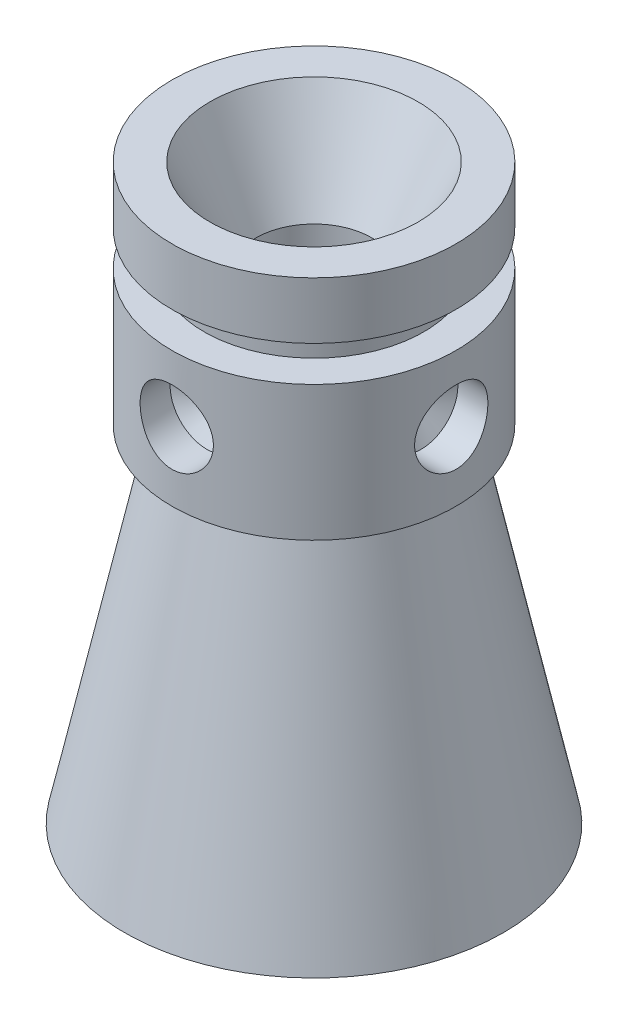
ISO-10303-21;
HEADER;
FILE_DESCRIPTION(('STEP AP214'),'2;1');
FILE_NAME('part.step','',(''),(''),'','','');
FILE_SCHEMA(('AUTOMOTIVE_DESIGN { 1 0 10303 214 1 1 1 1 }'));
ENDSEC;
DATA;
#1=APPLICATION_CONTEXT('core data for automotive mechanical design processes');
#2=APPLICATION_PROTOCOL_DEFINITION('international standard','automotive_design',2000,#1);
#3=PRODUCT_CONTEXT('',#1,'mechanical');
#4=PRODUCT('Part','Part','',(#3));
#5=PRODUCT_RELATED_PRODUCT_CATEGORY('part','',(#4));
#6=PRODUCT_DEFINITION_FORMATION('','',#4);
#7=PRODUCT_DEFINITION_CONTEXT('part definition',#1,'design');
#8=PRODUCT_DEFINITION('design','',#6,#7);
#9=PRODUCT_DEFINITION_SHAPE('','',#8);
#10=(LENGTH_UNIT() NAMED_UNIT(*) SI_UNIT(.MILLI.,.METRE.));
#11=(NAMED_UNIT(*) PLANE_ANGLE_UNIT() SI_UNIT($,.RADIAN.));
#12=(NAMED_UNIT(*) SI_UNIT($,.STERADIAN.) SOLID_ANGLE_UNIT());
#13=UNCERTAINTY_MEASURE_WITH_UNIT(LENGTH_MEASURE(1.E-05),#10,'distance_accuracy_value','');
#14=(GEOMETRIC_REPRESENTATION_CONTEXT(3) GLOBAL_UNCERTAINTY_ASSIGNED_CONTEXT((#13)) GLOBAL_UNIT_ASSIGNED_CONTEXT((#10,
#11,#12)) REPRESENTATION_CONTEXT('',''));
#15=CARTESIAN_POINT('',(0.,0.,0.));
#16=DIRECTION('',(0.,0.,1.));
#17=DIRECTION('',(1.,0.,0.));
#18=AXIS2_PLACEMENT_3D('',#15,#16,#17);
#19=CARTESIAN_POINT('',(0.,-38.4162585670867,0.));
#20=DIRECTION('',(0.,-1.,0.));
#21=DIRECTION('',(1.,0.,0.));
#22=AXIS2_PLACEMENT_3D('',#19,#20,#21);
#23=CONICAL_SURFACE('',#22,12.7,0.20943951023932);
#24=CARTESIAN_POINT('',(0.,-15.24,0.));
#25=DIRECTION('',(0.,1.,0.));
#26=DIRECTION('',(-1.,0.,0.));
#27=AXIS2_PLACEMENT_3D('',#24,#25,#26);
#28=CIRCLE('',#27,7.77373416660465);
#29=CARTESIAN_POINT('',(-7.77373416660464,-15.24,0.));
#30=VERTEX_POINT('',#29);
#31=EDGE_CURVE('E128',#30,#30,#28,.T.);
#32=ORIENTED_EDGE('',*,*,#31,.F.);
#33=EDGE_LOOP('',(#32));
#34=FACE_BOUND('',#33,.T.);
#35=CARTESIAN_POINT('',(0.,-38.4162585670867,0.));
#36=DIRECTION('',(0.,1.,0.));
#37=DIRECTION('',(-1.,0.,0.));
#38=AXIS2_PLACEMENT_3D('',#35,#36,#37);
#39=CIRCLE('',#38,12.7);
#40=CARTESIAN_POINT('',(-12.7,-38.4162585670867,0.));
#41=VERTEX_POINT('',#40);
#42=EDGE_CURVE('E95',#41,#41,#39,.T.);
#43=ORIENTED_EDGE('',*,*,#42,.T.);
#44=EDGE_LOOP('',(#43));
#45=FACE_BOUND('',#44,.T.);
#46=ADVANCED_FACE('F49',(#34,#45),#23,.T.);
#47=CARTESIAN_POINT('',(-9.525,-15.24,0.));
#48=DIRECTION('',(0.,-1.,0.));
#49=DIRECTION('',(1.,0.,0.));
#50=AXIS2_PLACEMENT_3D('',#47,#48,#49);
#51=PLANE('',#50);
#52=ORIENTED_EDGE('',*,*,#31,.T.);
#53=EDGE_LOOP('',(#52));
#54=FACE_BOUND('',#53,.T.);
#55=CARTESIAN_POINT('',(0.,-15.24,0.));
#56=DIRECTION('',(0.,1.,0.));
#57=DIRECTION('',(-1.,0.,0.));
#58=AXIS2_PLACEMENT_3D('',#55,#56,#57);
#59=CIRCLE('',#58,9.525);
#60=CARTESIAN_POINT('',(-9.525,-15.24,0.));
#61=VERTEX_POINT('',#60);
#62=EDGE_CURVE('E125',#61,#61,#59,.T.);
#63=ORIENTED_EDGE('',*,*,#62,.F.);
#64=EDGE_LOOP('',(#63));
#65=FACE_BOUND('',#64,.T.);
#66=ADVANCED_FACE('F194',(#54,#65),#51,.T.);
#67=CARTESIAN_POINT('',(0.,0.,0.));
#68=DIRECTION('',(0.,1.,0.));
#69=DIRECTION('',(-1.,0.,0.));
#70=AXIS2_PLACEMENT_3D('',#67,#68,#69);
#71=CYLINDRICAL_SURFACE('',#70,9.525);
#72=CARTESIAN_POINT('',(0.,-8.1788,-9.525));
#73=CARTESIAN_POINT('',(0.135632492235797,-8.17880353898719,-9.52499781246367));
#74=CARTESIAN_POINT('',(0.271303731287123,-8.19006653448816,-9.52207426782337));
#75=CARTESIAN_POINT('',(0.538748416943095,-8.23474767275234,-9.51069525089144));
#76=CARTESIAN_POINT('',(0.670519774125029,-8.26817747503226,-9.50223686736122));
#77=CARTESIAN_POINT('',(0.926264726293178,-8.35604098265588,-9.48072336699393));
#78=CARTESIAN_POINT('',(1.05024779121658,-8.4104485823769,-9.46767396516612));
#79=CARTESIAN_POINT('',(1.28732812222406,-8.53862906263181,-9.43836313550102));
#80=CARTESIAN_POINT('',(1.40042484949499,-8.61240290101392,-9.4221015487999));
#81=CARTESIAN_POINT('',(1.61499036171315,-8.77892201531211,-9.387730351627));
#82=CARTESIAN_POINT('',(1.71618770567399,-8.8720108766162,-9.36959076045332));
#83=CARTESIAN_POINT('',(1.90172123805714,-9.07378251088977,-9.3337039996612));
#84=CARTESIAN_POINT('',(1.9860553996045,-9.18246715570544,-9.3159568774434));
#85=CARTESIAN_POINT('',(2.13676734109603,-9.41448070107525,-9.28256012725421));
#86=CARTESIAN_POINT('',(2.20283740517176,-9.53801545031178,-9.26694845074925));
#87=CARTESIAN_POINT('',(2.31316532121822,-9.79490691829615,-9.24002913607497));
#88=CARTESIAN_POINT('',(2.35742691115491,-9.92826194934352,-9.22872076039688));
#89=CARTESIAN_POINT('',(2.42194754776775,-10.1980135114867,-9.21199722512144));
#90=CARTESIAN_POINT('',(2.44269659797878,-10.334285217627,-9.20646195669085));
#91=CARTESIAN_POINT('',(2.46113011142581,-10.6084791056988,-9.20155215677345));
#92=CARTESIAN_POINT('',(2.45881858820742,-10.746400996253,-9.20217655323605));
#93=CARTESIAN_POINT('',(2.43158660466504,-11.0161922572968,-9.20940778609847));
#94=CARTESIAN_POINT('',(2.40725427091501,-11.1481258201491,-9.21585899262482));
#95=CARTESIAN_POINT('',(2.33761134302182,-11.4059717439491,-9.23376838414501));
#96=CARTESIAN_POINT('',(2.29229916809971,-11.531883650391,-9.24522694642703));
#97=CARTESIAN_POINT('',(2.18149203307325,-11.7756682850472,-9.27199995943671));
#98=CARTESIAN_POINT('',(2.11578707031655,-11.8934410057394,-9.28735421244326));
#99=CARTESIAN_POINT('',(1.9662061746705,-12.1164981553133,-9.32016660973185));
#100=CARTESIAN_POINT('',(1.88232687313139,-12.2217802634291,-9.33762514378002));
#101=CARTESIAN_POINT('',(1.69575045115176,-12.4202332221476,-9.37333072608175));
#102=CARTESIAN_POINT('',(1.59255815895203,-12.5129377451178,-9.39158559815287));
#103=CARTESIAN_POINT('',(1.37187092289782,-12.6798176328766,-9.42634893835807));
#104=CARTESIAN_POINT('',(1.25437548459846,-12.7539923568388,-9.44285734608181));
#105=CARTESIAN_POINT('',(1.00772506118327,-12.8818943295515,-9.47235878254512));
#106=CARTESIAN_POINT('',(0.878526927485355,-12.935541754303,-9.48533803207389));
#107=CARTESIAN_POINT('',(0.612535427996886,-13.0202236733552,-9.50621885687161));
#108=CARTESIAN_POINT('',(0.475743618624078,-13.0512627832278,-9.5141214685162));
#109=CARTESIAN_POINT('',(0.20243134734827,-13.0891253632615,-9.52380364847628));
#110=CARTESIAN_POINT('',(0.0660043422474848,-13.0965833818602,-9.52574362551434));
#111=CARTESIAN_POINT('',(-0.206149628276651,-13.0888181345027,-9.52374086356539));
#112=CARTESIAN_POINT('',(-0.341876659840454,-13.0735970524096,-9.51979869099446));
#113=CARTESIAN_POINT('',(-0.606544620932313,-13.0214275538207,-9.50657776516511));
#114=CARTESIAN_POINT('',(-0.735559194986774,-12.9848289781377,-9.49738499003739));
#115=CARTESIAN_POINT('',(-0.985608289226642,-12.8913461301216,-9.47470194042491));
#116=CARTESIAN_POINT('',(-1.10664197283324,-12.8344597351562,-9.46121121627892));
#117=CARTESIAN_POINT('',(-1.33979040066358,-12.7008112945829,-9.43104841223513));
#118=CARTESIAN_POINT('',(-1.451696939741,-12.6236986602258,-9.41432173855624));
#119=CARTESIAN_POINT('',(-1.66120566581614,-12.4522312892667,-9.37962242913525));
#120=CARTESIAN_POINT('',(-1.75880520930481,-12.3578733734657,-9.36164956403528));
#121=CARTESIAN_POINT('',(-1.93957247151284,-12.1516402113158,-9.32590001087606));
#122=CARTESIAN_POINT('',(-2.02229379094201,-12.0393699533282,-9.3081408750614));
#123=CARTESIAN_POINT('',(-2.16772659095089,-11.8021709590843,-9.27535258573803));
#124=CARTESIAN_POINT('',(-2.23043894100607,-11.6772427731801,-9.26032331361727));
#125=CARTESIAN_POINT('',(-2.33360251825881,-11.4189261438211,-9.23486593745744));
#126=CARTESIAN_POINT('',(-2.37418483957775,-11.2855928598007,-9.22441081164849));
#127=CARTESIAN_POINT('',(-2.4322665612745,-11.0136821622309,-9.2092682818767));
#128=CARTESIAN_POINT('',(-2.44977140624095,-10.8751059935565,-9.2045795174938));
#129=CARTESIAN_POINT('',(-2.46090304802691,-10.6011985939546,-9.20160902688582));
#130=CARTESIAN_POINT('',(-2.45524516512481,-10.4658980648248,-9.20313535582278));
#131=CARTESIAN_POINT('',(-2.42185956117734,-10.198250475288,-9.21197663289595));
#132=CARTESIAN_POINT('',(-2.39413234085826,-10.065903347942,-9.21929144969842));
#133=CARTESIAN_POINT('',(-2.31779736783771,-9.80875503756895,-9.23877504507644));
#134=CARTESIAN_POINT('',(-2.26933201471714,-9.6839088972902,-9.25091068123445));
#135=CARTESIAN_POINT('',(-2.15300802312338,-9.44402806991174,-9.27867130546447));
#136=CARTESIAN_POINT('',(-2.08514652486313,-9.32899483288622,-9.29429680801155));
#137=CARTESIAN_POINT('',(-1.92974936749516,-9.10856839498068,-9.32781678611136));
#138=CARTESIAN_POINT('',(-1.84172122240036,-9.0035300656764,-9.34576208598717));
#139=CARTESIAN_POINT('',(-1.64943839470655,-8.80948347827698,-9.38160570875252));
#140=CARTESIAN_POINT('',(-1.54517982354077,-8.72047907272203,-9.39950401933645));
#141=CARTESIAN_POINT('',(-1.32092496361625,-8.55931601554519,-9.43365682993485));
#142=CARTESIAN_POINT('',(-1.20065985270898,-8.48752245704751,-9.44987215188289));
#143=CARTESIAN_POINT('',(-0.949356484131711,-8.36528617439028,-9.47841170674951));
#144=CARTESIAN_POINT('',(-0.81832564127577,-8.31482889983395,-9.49073858994842));
#145=CARTESIAN_POINT('',(-0.573037369789335,-8.24376034827194,-9.50839724385411));
#146=CARTESIAN_POINT('',(-0.459897445999428,-8.21945470140344,-9.51457929222433));
#147=CARTESIAN_POINT('',(-0.231180924446513,-8.18697371092571,-9.52288142833016));
#148=CARTESIAN_POINT('',(-0.115604536571404,-8.17879698359172,-9.52500186451728));
#149=CARTESIAN_POINT('',(0.,-8.1788,-9.525));
#150=B_SPLINE_CURVE_WITH_KNOTS('',3,(#72,#73,#74,#75,#76,#77,#78,#79,#80,#81,#82,#83,#84,#85,
#86,#87,#88,#89,#90,#91,#92,#93,#94,#95,#96,#97,#98,#99,#100,#101,#102,#103,#104,#105,#106,#107,
#108,#109,#110,#111,#112,#113,#114,#115,#116,#117,#118,#119,#120,#121,#122,#123,#124,#125,#126,
#127,#128,#129,#130,#131,#132,#133,#134,#135,#136,#137,#138,#139,#140,#141,#142,#143,#144,#145,
#146,#147,#148,#149),.UNSPECIFIED.,.T.,.F.,(4,2,2,2,2,2,2,2,2,2,2,2,2,2,2,2,2,2,2,2,2,2,2,2,2,2,
2,2,2,2,2,2,2,2,2,2,2,2,4),(0.,0.406473686202802,0.813161343240186,1.21934452665316,
1.62554780354791,2.03971484156758,2.45393163062685,2.87475230368938,3.2955008231013,
3.70730964680747,4.11904679906675,4.52010176214565,4.92118694863952,5.32654777081425,
5.73198379179347,6.14976363244522,6.56755791941419,6.98696074946595,7.4062779328484,
7.81421114891419,8.22210508596815,8.62350381045773,9.02494454399339,9.43386523372195,
9.84286138490288,10.2626002036206,10.6823207804033,11.0995272285728,11.5166352290525,
11.9209606517297,12.3252769010187,12.7268603507196,13.1285030408572,13.5412606648185,
13.954117331946,14.3750806952732,14.7957565155107,15.1422386395958,15.4886910371544),.UNSPECIFIED.);
#151=CARTESIAN_POINT('',(0.,-8.1788,-9.525));
#152=VERTEX_POINT('',#151);
#153=EDGE_CURVE('E11',#152,#152,#150,.T.);
#154=ORIENTED_EDGE('',*,*,#153,.F.);
#155=EDGE_LOOP('',(#154));
#156=FACE_BOUND('',#155,.T.);
#157=CARTESIAN_POINT('',(9.20253033124586,-10.63625,-2.45745));
#158=CARTESIAN_POINT('',(9.20253282061626,-10.5007022364443,-2.45744641402374));
#159=CARTESIAN_POINT('',(9.20555785819209,-10.36511563082,-2.44619700161917));
#160=CARTESIAN_POINT('',(9.21729777099537,-10.0978464867518,-2.40157469745733));
#161=CARTESIAN_POINT('',(9.22601574051651,-9.96616611218639,-2.36818977417821));
#162=CARTESIAN_POINT('',(9.24808990601585,-9.71061416460928,-2.2804574060139));
#163=CARTESIAN_POINT('',(9.26143986050791,-9.5867323472816,-2.22613815876303));
#164=CARTESIAN_POINT('',(9.2912659353246,-9.34982365577362,-2.0981661383482));
#165=CARTESIAN_POINT('',(9.30774224087956,-9.23679742536405,-2.02451221954264));
#166=CARTESIAN_POINT('',(9.34239681125506,-9.02216075325365,-1.85811777943171));
#167=CARTESIAN_POINT('',(9.36060369336536,-8.92084217082974,-1.76500666537862));
#168=CARTESIAN_POINT('',(9.39642030375577,-8.73507225176326,-1.5631385796116));
#169=CARTESIAN_POINT('',(9.41402997324792,-8.65062257167082,-1.45438007310382));
#170=CARTESIAN_POINT('',(9.44698593216792,-8.4997827341067,-1.2222934923744));
#171=CARTESIAN_POINT('',(9.4622945189036,-8.43368091994954,-1.09877219761104));
#172=CARTESIAN_POINT('',(9.48859608374544,-8.32329069084439,-0.841909481301606));
#173=CARTESIAN_POINT('',(9.49958974134042,-8.27899884111586,-0.708569609856012));
#174=CARTESIAN_POINT('',(9.51582043394744,-8.21442526884803,-0.43889923255138));
#175=CARTESIAN_POINT('',(9.5211762230654,-8.19364751574495,-0.30269477487751));
#176=CARTESIAN_POINT('',(9.52594220701936,-8.17513323273566,-0.0286351426214071));
#177=CARTESIAN_POINT('',(9.52535333573137,-8.17739308373923,0.109219769284348));
#178=CARTESIAN_POINT('',(9.51838409275901,-8.20453662219894,0.379221048130122));
#179=CARTESIAN_POINT('',(9.51214084875805,-8.22888465858391,0.511425340500211));
#180=CARTESIAN_POINT('',(9.49472503375544,-8.29865035914093,0.769804274903828));
#181=CARTESIAN_POINT('',(9.4835521911537,-8.34406918423162,0.895978584286163));
#182=CARTESIAN_POINT('',(9.45732581146241,-8.45510972844474,1.14010641246078));
#183=CARTESIAN_POINT('',(9.442236523726,-8.52091870874464,1.25797075782457));
#184=CARTESIAN_POINT('',(9.40980888795899,-8.6707286589124,1.48116848758232));
#185=CARTESIAN_POINT('',(9.39247012637968,-8.75473297576095,1.58649956098604));
#186=CARTESIAN_POINT('',(9.356839208877,-8.94140738161034,1.78483674374878));
#187=CARTESIAN_POINT('',(9.33853397595646,-9.04454515267133,1.87740081511313));
#188=CARTESIAN_POINT('',(9.30348690132806,-9.26507037571276,2.04402209218699));
#189=CARTESIAN_POINT('',(9.28674514282835,-9.38245858533815,2.11807831325937));
#190=CARTESIAN_POINT('',(9.2566710214604,-9.6290625978517,2.24588975601094));
#191=CARTESIAN_POINT('',(9.24335774264326,-9.75833939076488,2.299532104839));
#192=CARTESIAN_POINT('',(9.22188892170264,-10.0245041587722,2.38418070385714));
#193=CARTESIAN_POINT('',(9.21373219385341,-10.1613903762315,2.4151921581731));
#194=CARTESIAN_POINT('',(9.20375066213879,-10.4347724871415,2.45295177760207));
#195=CARTESIAN_POINT('',(9.20175462879208,-10.5711715811598,2.46035626898559));
#196=CARTESIAN_POINT('',(9.20385326403587,-10.8432576804668,2.45249403357838));
#197=CARTESIAN_POINT('',(9.20794733104323,-10.9789447547605,2.43722954604097));
#198=CARTESIAN_POINT('',(9.22160016046895,-11.2432749307353,2.38503963633819));
#199=CARTESIAN_POINT('',(9.23106096972559,-11.3720001795153,2.34850217892558));
#200=CARTESIAN_POINT('',(9.25428701621497,-11.6214972504174,2.25523650366697));
#201=CARTESIAN_POINT('',(9.26805278842321,-11.7422680817887,2.1985057762927));
#202=CARTESIAN_POINT('',(9.29869392912777,-11.9751924635482,2.06510977583106));
#203=CARTESIAN_POINT('',(9.31562787798557,-12.0871152958199,1.98805540295607));
#204=CARTESIAN_POINT('',(9.35055643412021,-12.2966832735275,1.81668679914962));
#205=CARTESIAN_POINT('',(9.36855122716743,-12.3943259077948,1.72236953909436));
#206=CARTESIAN_POINT('',(9.40415856412249,-12.5752514933464,1.51612913014691));
#207=CARTESIAN_POINT('',(9.42174788414069,-12.6580786739202,1.40380137345416));
#208=CARTESIAN_POINT('',(9.45406451442078,-12.8036976012778,1.16645275805285));
#209=CARTESIAN_POINT('',(9.46879197597323,-12.8664904072804,1.04143257085486));
#210=CARTESIAN_POINT('',(9.49363138455986,-12.9696968817542,0.783122577852127));
#211=CARTESIAN_POINT('',(9.50377711770396,-13.0102748527382,0.649901822349642));
#212=CARTESIAN_POINT('',(9.51845822440917,-13.0683857160971,0.378233674701578));
#213=CARTESIAN_POINT('',(9.5229947561348,-13.0859233657882,0.239787367591838));
#214=CARTESIAN_POINT('',(9.52589552971851,-13.0971736875384,-0.0341315476979129));
#215=CARTESIAN_POINT('',(9.52443352335457,-13.091557017669,-0.169575174549085));
#216=CARTESIAN_POINT('',(9.5158904015327,-13.058204219357,-0.437520234660072));
#217=CARTESIAN_POINT('',(9.50880947345723,-13.0304688285397,-0.570021765882808));
#218=CARTESIAN_POINT('',(9.48985464591976,-12.954035046978,-0.827569767066795));
#219=CARTESIAN_POINT('',(9.47801010839406,-12.9054649571832,-0.952656616475564));
#220=CARTESIAN_POINT('',(9.45077107903939,-12.7888558493343,-1.19297680205785));
#221=CARTESIAN_POINT('',(9.43537611507838,-12.7208142416878,-1.30820882495054));
#222=CARTESIAN_POINT('',(9.40220464678842,-12.5651872073271,-1.52870136989216));
#223=CARTESIAN_POINT('',(9.38437781653942,-12.4771516068796,-1.63363657228331));
#224=CARTESIAN_POINT('',(9.34856719369872,-12.2849000487682,-1.82747181300578));
#225=CARTESIAN_POINT('',(9.33058336181606,-12.1806799244735,-1.91636770931541));
#226=CARTESIAN_POINT('',(9.29607887666063,-11.9564827662692,-2.07737204980839));
#227=CARTESIAN_POINT('',(9.27959514066756,-11.8362298477767,-2.1491049008091));
#228=CARTESIAN_POINT('',(9.25046509973516,-11.5849615205986,-2.27123077041183));
#229=CARTESIAN_POINT('',(9.2378161362258,-11.4539536485464,-2.32163858286199));
#230=CARTESIAN_POINT('',(9.21966118744292,-11.2087851288843,-2.39260431180691));
#231=CARTESIAN_POINT('',(9.21328715134702,-11.0957471236009,-2.41686653736904));
#232=CARTESIAN_POINT('',(9.20472086776104,-10.8672319867811,-2.44929011944506));
#233=CARTESIAN_POINT('',(9.20252820996434,-10.75175509569,-2.45745305573858));
#234=CARTESIAN_POINT('',(9.20253033124586,-10.63625,-2.45745));
#235=B_SPLINE_CURVE_WITH_KNOTS('',3,(#157,#158,#159,#160,#161,#162,#163,#164,#165,#166,#167,
#168,#169,#170,#171,#172,#173,#174,#175,#176,#177,#178,#179,#180,#181,#182,#183,#184,#185,#186,
#187,#188,#189,#190,#191,#192,#193,#194,#195,#196,#197,#198,#199,#200,#201,#202,#203,#204,#205,
#206,#207,#208,#209,#210,#211,#212,#213,#214,#215,#216,#217,#218,#219,#220,#221,#222,#223,#224,
#225,#226,#227,#228,#229,#230,#231,#232,#233,#234),.UNSPECIFIED.,.T.,.F.,(4,2,2,2,2,2,2,2,2,2,2,
2,2,2,2,2,2,2,2,2,2,2,2,2,2,2,2,2,2,2,2,2,2,2,2,2,2,2,4),(0.,0.406218859847161,
0.812658696841881,1.21855297949672,1.62447131812657,2.03897122477347,2.45351181590962,
2.87423929037592,3.29490048462881,3.70651200656608,4.11805886742742,4.51988471490493,
4.92173270405608,5.32738646316293,5.73311490459725,6.15052199831287,6.56795129380049,
6.98765622658927,7.40726461497652,7.81510036314722,8.22289582777406,8.62347728023823,
9.02410853254487,9.43305024190081,9.84206377729024,10.2620555796765,10.6820251733846,
11.0988451699529,11.5155790888878,11.9203285117399,12.3250644373843,12.7273429768786,
13.1296750418343,13.5421678168114,13.9547669627378,14.3757049352098,14.7963504090345,
15.142537995568,15.4886916099611),.UNSPECIFIED.);
#236=CARTESIAN_POINT('',(9.20253033124586,-10.63625,-2.45745));
#237=VERTEX_POINT('',#236);
#238=EDGE_CURVE('E61',#237,#237,#235,.T.);
#239=ORIENTED_EDGE('',*,*,#238,.F.);
#240=EDGE_LOOP('',(#239));
#241=FACE_BOUND('',#240,.T.);
#242=CARTESIAN_POINT('',(0.,-13.0937,9.525));
#243=CARTESIAN_POINT('',(0.135632492235797,-13.0936964610128,9.52499781246367));
#244=CARTESIAN_POINT('',(0.271303731287124,-13.0824334655119,9.52207426782337));
#245=CARTESIAN_POINT('',(0.538748416943097,-13.0377523272477,9.51069525089144));
#246=CARTESIAN_POINT('',(0.670519774125033,-13.0043225249678,9.50223686736122));
#247=CARTESIAN_POINT('',(0.926264726293187,-12.9164590173442,9.48072336699393));
#248=CARTESIAN_POINT('',(1.05024779121659,-12.8620514176232,9.46767396516612));
#249=CARTESIAN_POINT('',(1.28732812222408,-12.7338709373683,9.43836313550102));
#250=CARTESIAN_POINT('',(1.40042484949502,-12.6600970989862,9.4221015487999));
#251=CARTESIAN_POINT('',(1.61499036171318,-12.493577984688,9.387730351627));
#252=CARTESIAN_POINT('',(1.71618770567402,-12.4004891233839,9.36959076045332));
#253=CARTESIAN_POINT('',(1.90172123805719,-12.1987174891103,9.33370399966119));
#254=CARTESIAN_POINT('',(1.98605539960455,-12.0900328442947,9.31595687744339));
#255=CARTESIAN_POINT('',(2.1367673410961,-11.8580192989249,9.28256012725419));
#256=CARTESIAN_POINT('',(2.20283740517183,-11.7344845496884,9.26694845074923));
#257=CARTESIAN_POINT('',(2.3131653212183,-11.477593081704,9.24002913607495));
#258=CARTESIAN_POINT('',(2.357426911155,-11.3442380506566,9.22872076039685));
#259=CARTESIAN_POINT('',(2.42194754776787,-11.0744864885134,9.21199722512141));
#260=CARTESIAN_POINT('',(2.4426965979789,-10.9382147823732,9.20646195669082));
#261=CARTESIAN_POINT('',(2.46113011142594,-10.6640208943013,9.20155215677341));
#262=CARTESIAN_POINT('',(2.45881858820757,-10.5260990037471,9.20217655323601));
#263=CARTESIAN_POINT('',(2.43158660466519,-10.2563077427033,9.20940778609843));
#264=CARTESIAN_POINT('',(2.40725427091517,-10.124374179851,9.21585899262478));
#265=CARTESIAN_POINT('',(2.337611343022,-9.86652825605103,9.23376838414497));
#266=CARTESIAN_POINT('',(2.2922991680999,-9.74061634960914,9.24522694642698));
#267=CARTESIAN_POINT('',(2.18149203307345,-9.4968317149529,9.27199995943667));
#268=CARTESIAN_POINT('',(2.11578707031676,-9.3790589942607,9.28735421244321));
#269=CARTESIAN_POINT('',(1.96620617467072,-9.15600184468683,9.3201666097318));
#270=CARTESIAN_POINT('',(1.88232687313162,-9.05071973657105,9.33762514377997));
#271=CARTESIAN_POINT('',(1.695750451152,-8.8522667778525,9.37333072608171));
#272=CARTESIAN_POINT('',(1.59255815895228,-8.75956225488233,9.39158559815282));
#273=CARTESIAN_POINT('',(1.37187092289807,-8.59268236712345,9.42634893835803));
#274=CARTESIAN_POINT('',(1.25437548459872,-8.51850764316128,9.44285734608178));
#275=CARTESIAN_POINT('',(1.00772506118354,-8.39060567044852,9.47235878254509));
#276=CARTESIAN_POINT('',(0.878526927485626,-8.33695824569706,9.48533803207386));
#277=CARTESIAN_POINT('',(0.612535427997161,-8.25227632664484,9.50621885687159));
#278=CARTESIAN_POINT('',(0.475743618624354,-8.22123721677224,9.51412146851619));
#279=CARTESIAN_POINT('',(0.202431347348546,-8.18337463673847,9.52380364847627));
#280=CARTESIAN_POINT('',(0.0660043422477603,-8.1759166181398,9.52574362551434));
#281=CARTESIAN_POINT('',(-0.206149628276378,-8.18368186549726,9.5237408635654));
#282=CARTESIAN_POINT('',(-0.341876659840183,-8.19890294759042,9.51979869099447));
#283=CARTESIAN_POINT('',(-0.606544620932047,-8.25107244617923,9.50657776516512));
#284=CARTESIAN_POINT('',(-0.735559194986509,-8.28767102186222,9.49738499003742));
#285=CARTESIAN_POINT('',(-0.985608289226384,-8.3811538698784,9.47470194042493));
#286=CARTESIAN_POINT('',(-1.10664197283299,-8.43804026484378,9.46121121627895));
#287=CARTESIAN_POINT('',(-1.33979040066333,-8.571688705417,9.43104841223516));
#288=CARTESIAN_POINT('',(-1.45169693974076,-8.6488013397741,9.41432173855627));
#289=CARTESIAN_POINT('',(-1.6612056658159,-8.82026871073323,9.37962242913529));
#290=CARTESIAN_POINT('',(-1.75880520930458,-8.91462662653424,9.36164956403532));
#291=CARTESIAN_POINT('',(-1.93957247151262,-9.12085978868405,9.32590001087611));
#292=CARTESIAN_POINT('',(-2.02229379094179,-9.23313004667172,9.30814087506145));
#293=CARTESIAN_POINT('',(-2.16772659095069,-9.47032904091561,9.27535258573807));
#294=CARTESIAN_POINT('',(-2.23043894100588,-9.59525722681972,9.26032331361732));
#295=CARTESIAN_POINT('',(-2.33360251825863,-9.85357385617875,9.23486593745748));
#296=CARTESIAN_POINT('',(-2.37418483957757,-9.9869071401992,9.22441081164854));
#297=CARTESIAN_POINT('',(-2.43226656127434,-10.258817837769,9.20926828187674));
#298=CARTESIAN_POINT('',(-2.4497714062408,-10.3973940064434,9.20457951749384));
#299=CARTESIAN_POINT('',(-2.46090304802678,-10.6713014060453,9.20160902688586));
#300=CARTESIAN_POINT('',(-2.45524516512468,-10.806601935175,9.20313535582281));
#301=CARTESIAN_POINT('',(-2.42185956117723,-11.0742495247118,9.21197663289598));
#302=CARTESIAN_POINT('',(-2.39413234085815,-11.2065966520579,9.21929144969845));
#303=CARTESIAN_POINT('',(-2.31779736783761,-11.4637449624309,9.23877504507646));
#304=CARTESIAN_POINT('',(-2.26933201471705,-11.5885911027097,9.25091068123447));
#305=CARTESIAN_POINT('',(-2.15300802312331,-11.8284719300881,9.27867130546448));
#306=CARTESIAN_POINT('',(-2.08514652486306,-11.9435051671137,9.29429680801156));
#307=CARTESIAN_POINT('',(-1.9297493674951,-12.1639316050192,9.32781678611137));
#308=CARTESIAN_POINT('',(-1.84172122240031,-12.2689699343235,9.34576208598718));
#309=CARTESIAN_POINT('',(-1.64943839470652,-12.4630165217229,9.38160570875253));
#310=CARTESIAN_POINT('',(-1.54517982354074,-12.5520209272779,9.39950401933645));
#311=CARTESIAN_POINT('',(-1.32092496361623,-12.7131839844547,9.43365682993485));
#312=CARTESIAN_POINT('',(-1.20065985270896,-12.7849775429524,9.44987215188289));
#313=CARTESIAN_POINT('',(-0.949356484131699,-12.9072138256097,9.47841170674951));
#314=CARTESIAN_POINT('',(-0.818325641275762,-12.957671100166,9.49073858994843));
#315=CARTESIAN_POINT('',(-0.57303736978933,-13.028739651728,9.50839724385411));
#316=CARTESIAN_POINT('',(-0.459897445999424,-13.0530452985965,9.51457929222433));
#317=CARTESIAN_POINT('',(-0.231180924446511,-13.0855262890743,9.52288142833016));
#318=CARTESIAN_POINT('',(-0.115604536571403,-13.0937030164083,9.52500186451727));
#319=CARTESIAN_POINT('',(0.,-13.0937,9.525));
#320=B_SPLINE_CURVE_WITH_KNOTS('',3,(#242,#243,#244,#245,#246,#247,#248,#249,#250,#251,#252,
#253,#254,#255,#256,#257,#258,#259,#260,#261,#262,#263,#264,#265,#266,#267,#268,#269,#270,#271,
#272,#273,#274,#275,#276,#277,#278,#279,#280,#281,#282,#283,#284,#285,#286,#287,#288,#289,#290,
#291,#292,#293,#294,#295,#296,#297,#298,#299,#300,#301,#302,#303,#304,#305,#306,#307,#308,#309,
#310,#311,#312,#313,#314,#315,#316,#317,#318,#319),.UNSPECIFIED.,.T.,.F.,(4,2,2,2,2,2,2,2,2,2,2,
2,2,2,2,2,2,2,2,2,2,2,2,2,2,2,2,2,2,2,2,2,2,2,2,2,2,2,4),(0.,0.406473686202801,
0.813161343240184,1.21934452665316,1.6255478035479,2.03971484156758,2.45393163062684,
2.87475230368937,3.2955008231013,3.70730964680747,4.11904679906675,4.52010176214565,
4.92118694863952,5.32654777081424,5.73198379179347,6.14976363244522,6.56755791941418,
6.98696074946595,7.4062779328484,7.81421114891419,8.22210508596816,8.62350381045774,
9.02494454399339,9.43386523372195,9.84286138490287,10.2626002036206,10.6823207804033,
11.0995272285728,11.5166352290525,11.9209606517297,12.3252769010187,12.7268603507196,
13.1285030408572,13.5412606648185,13.954117331946,14.3750806952732,14.7957565155107,
15.1422386395957,15.4886910371544),.UNSPECIFIED.);
#321=CARTESIAN_POINT('',(0.,-13.0937,9.525));
#322=VERTEX_POINT('',#321);
#323=EDGE_CURVE('E138',#322,#322,#320,.T.);
#324=ORIENTED_EDGE('',*,*,#323,.F.);
#325=EDGE_LOOP('',(#324));
#326=FACE_BOUND('',#325,.T.);
#327=CARTESIAN_POINT('',(-9.525,-13.0937,0.));
#328=CARTESIAN_POINT('',(-9.52499781246366,-13.0936964610128,0.135632492235796));
#329=CARTESIAN_POINT('',(-9.52207426782337,-13.0824334655118,0.271303731287122));
#330=CARTESIAN_POINT('',(-9.51069525089144,-13.0377523272477,0.538748416943095));
#331=CARTESIAN_POINT('',(-9.50223686736122,-13.0043225249678,0.670519774125031));
#332=CARTESIAN_POINT('',(-9.48072336699392,-12.9164590173442,0.926264726293184));
#333=CARTESIAN_POINT('',(-9.46767396516612,-12.8620514176231,1.05024779121659));
#334=CARTESIAN_POINT('',(-9.43836313550102,-12.7338709373682,1.28732812222408));
#335=CARTESIAN_POINT('',(-9.4221015487999,-12.6600970989861,1.40042484949501));
#336=CARTESIAN_POINT('',(-9.38773035162699,-12.493577984688,1.61499036171317));
#337=CARTESIAN_POINT('',(-9.36959076045331,-12.4004891233839,1.71618770567401));
#338=CARTESIAN_POINT('',(-9.33370399966119,-12.1987174891103,1.90172123805717));
#339=CARTESIAN_POINT('',(-9.31595687744339,-12.0900328442947,1.98605539960454));
#340=CARTESIAN_POINT('',(-9.28256012725419,-11.8580192989248,2.13676734109608));
#341=CARTESIAN_POINT('',(-9.26694845074923,-11.7344845496883,2.20283740517181));
#342=CARTESIAN_POINT('',(-9.24002913607495,-11.4775930817039,2.31316532121828));
#343=CARTESIAN_POINT('',(-9.22872076039686,-11.3442380506566,2.35742691115498));
#344=CARTESIAN_POINT('',(-9.21199722512141,-11.0744864885134,2.42194754776784));
#345=CARTESIAN_POINT('',(-9.20646195669083,-10.9382147823731,2.44269659797887));
#346=CARTESIAN_POINT('',(-9.20155215677342,-10.6640208943013,2.46113011142591));
#347=CARTESIAN_POINT('',(-9.20217655323602,-10.5260990037471,2.45881858820753));
#348=CARTESIAN_POINT('',(-9.20940778609843,-10.2563077427033,2.43158660466515));
#349=CARTESIAN_POINT('',(-9.21585899262478,-10.124374179851,2.40725427091513));
#350=CARTESIAN_POINT('',(-9.23376838414498,-9.86652825605101,2.33761134302196));
#351=CARTESIAN_POINT('',(-9.24522694642699,-9.74061634960911,2.29229916809985));
#352=CARTESIAN_POINT('',(-9.27199995943668,-9.49683171495288,2.1814920330734));
#353=CARTESIAN_POINT('',(-9.28735421244322,-9.37905899426067,2.1157870703167));
#354=CARTESIAN_POINT('',(-9.32016660973181,-9.15600184468681,1.96620617467066));
#355=CARTESIAN_POINT('',(-9.33762514377998,-9.05071973657102,1.88232687313156));
#356=CARTESIAN_POINT('',(-9.37333072608172,-8.85226677785247,1.69575045115194));
#357=CARTESIAN_POINT('',(-9.39158559815283,-8.7595622548823,1.59255815895222));
#358=CARTESIAN_POINT('',(-9.42634893835804,-8.59268236712344,1.37187092289801));
#359=CARTESIAN_POINT('',(-9.44285734608179,-8.51850764316127,1.25437548459866));
#360=CARTESIAN_POINT('',(-9.4723587825451,-8.39060567044851,1.00772506118347));
#361=CARTESIAN_POINT('',(-9.48533803207387,-8.33695824569705,0.878526927485557));
#362=CARTESIAN_POINT('',(-9.50621885687159,-8.25227632664483,0.612535427997091));
#363=CARTESIAN_POINT('',(-9.51412146851619,-8.22123721677224,0.475743618624285));
#364=CARTESIAN_POINT('',(-9.52380364847627,-8.18337463673847,0.202431347348478));
#365=CARTESIAN_POINT('',(-9.52574362551434,-8.1759166181398,0.0660043422476924));
#366=CARTESIAN_POINT('',(-9.5237408635654,-8.18368186549726,-0.206149628276445));
#367=CARTESIAN_POINT('',(-9.51979869099446,-8.19890294759043,-0.34187665984025));
#368=CARTESIAN_POINT('',(-9.50657776516512,-8.25107244617924,-0.606544620932113));
#369=CARTESIAN_POINT('',(-9.49738499003741,-8.28767102186223,-0.735559194986575));
#370=CARTESIAN_POINT('',(-9.47470194042492,-8.38115386987841,-0.985608289226447));
#371=CARTESIAN_POINT('',(-9.46121121627895,-8.4380402648438,-1.10664197283305));
#372=CARTESIAN_POINT('',(-9.43104841223515,-8.57168870541702,-1.33979040066339));
#373=CARTESIAN_POINT('',(-9.41432173855626,-8.64880133977412,-1.45169693974082));
#374=CARTESIAN_POINT('',(-9.37962242913528,-8.82026871073325,-1.66120566581596));
#375=CARTESIAN_POINT('',(-9.36164956403531,-8.91462662653427,-1.75880520930464));
#376=CARTESIAN_POINT('',(-9.32590001087609,-9.12085978868408,-1.93957247151267));
#377=CARTESIAN_POINT('',(-9.30814087506143,-9.23313004667175,-2.02229379094184));
#378=CARTESIAN_POINT('',(-9.27535258573806,-9.47032904091564,-2.16772659095074));
#379=CARTESIAN_POINT('',(-9.2603233136173,-9.59525722681975,-2.23043894100593));
#380=CARTESIAN_POINT('',(-9.23486593745747,-9.85357385617879,-2.33360251825868));
#381=CARTESIAN_POINT('',(-9.22441081164853,-9.98690714019924,-2.37418483957762));
#382=CARTESIAN_POINT('',(-9.20926828187673,-10.258817837769,-2.43226656127438));
#383=CARTESIAN_POINT('',(-9.20457951749383,-10.3973940064434,-2.44977140624084));
#384=CARTESIAN_POINT('',(-9.20160902688585,-10.6713014060453,-2.46090304802681));
#385=CARTESIAN_POINT('',(-9.20313535582281,-10.8066019351751,-2.45524516512471));
#386=CARTESIAN_POINT('',(-9.21197663289597,-11.0742495247119,-2.42185956117725));
#387=CARTESIAN_POINT('',(-9.21929144969844,-11.2065966520579,-2.39413234085818));
#388=CARTESIAN_POINT('',(-9.23877504507645,-11.463744962431,-2.31779736783764));
#389=CARTESIAN_POINT('',(-9.25091068123447,-11.5885911027097,-2.26933201471708));
#390=CARTESIAN_POINT('',(-9.27867130546448,-11.8284719300882,-2.15300802312333));
#391=CARTESIAN_POINT('',(-9.29429680801156,-11.9435051671137,-2.08514652486308));
#392=CARTESIAN_POINT('',(-9.32781678611136,-12.1639316050192,-1.92974936749512));
#393=CARTESIAN_POINT('',(-9.34576208598717,-12.2689699343235,-1.84172122240032));
#394=CARTESIAN_POINT('',(-9.38160570875252,-12.463016521723,-1.64943839470653));
#395=CARTESIAN_POINT('',(-9.39950401933645,-12.5520209272779,-1.54517982354075));
#396=CARTESIAN_POINT('',(-9.43365682993485,-12.7131839844548,-1.32092496361624));
#397=CARTESIAN_POINT('',(-9.44987215188289,-12.7849775429524,-1.20065985270897));
#398=CARTESIAN_POINT('',(-9.4784117067495,-12.9072138256097,-0.949356484131705));
#399=CARTESIAN_POINT('',(-9.49073858994842,-12.957671100166,-0.818325641275767));
#400=CARTESIAN_POINT('',(-9.50839724385411,-13.028739651728,-0.573037369789336));
#401=CARTESIAN_POINT('',(-9.51457929222433,-13.0530452985965,-0.459897445999428));
#402=CARTESIAN_POINT('',(-9.52288142833016,-13.0855262890743,-0.231180924446514));
#403=CARTESIAN_POINT('',(-9.52500186451727,-13.0937030164083,-0.115604536571405));
#404=CARTESIAN_POINT('',(-9.525,-13.0937,0.));
#405=B_SPLINE_CURVE_WITH_KNOTS('',3,(#327,#328,#329,#330,#331,#332,#333,#334,#335,#336,#337,
#338,#339,#340,#341,#342,#343,#344,#345,#346,#347,#348,#349,#350,#351,#352,#353,#354,#355,#356,
#357,#358,#359,#360,#361,#362,#363,#364,#365,#366,#367,#368,#369,#370,#371,#372,#373,#374,#375,
#376,#377,#378,#379,#380,#381,#382,#383,#384,#385,#386,#387,#388,#389,#390,#391,#392,#393,#394,
#395,#396,#397,#398,#399,#400,#401,#402,#403,#404),.UNSPECIFIED.,.T.,.F.,(4,2,2,2,2,2,2,2,2,2,2,
2,2,2,2,2,2,2,2,2,2,2,2,2,2,2,2,2,2,2,2,2,2,2,2,2,2,2,4),(0.,0.406473686202802,
0.813161343240184,1.21934452665316,1.6255478035479,2.03971484156758,2.45393163062684,
2.87475230368937,3.2955008231013,3.70730964680747,4.11904679906675,4.52010176214565,
4.92118694863952,5.32654777081424,5.73198379179347,6.14976363244522,6.56755791941419,
6.98696074946595,7.4062779328484,7.81421114891419,8.22210508596815,8.62350381045773,
9.02494454399338,9.43386523372194,9.84286138490287,10.2626002036206,10.6823207804033,
11.0995272285728,11.5166352290525,11.9209606517297,12.3252769010187,12.7268603507196,
13.1285030408572,13.5412606648185,13.954117331946,14.3750806952732,14.7957565155107,
15.1422386395957,15.4886910371544),.UNSPECIFIED.);
#406=CARTESIAN_POINT('',(-9.525,-13.0937,0.));
#407=VERTEX_POINT('',#406);
#408=EDGE_CURVE('E131',#407,#407,#405,.T.);
#409=ORIENTED_EDGE('',*,*,#408,.F.);
#410=EDGE_LOOP('',(#409));
#411=FACE_BOUND('',#410,.T.);
#412=ORIENTED_EDGE('',*,*,#62,.T.);
#413=EDGE_LOOP('',(#412));
#414=FACE_BOUND('',#413,.T.);
#415=CARTESIAN_POINT('',(0.,-6.19125,0.));
#416=DIRECTION('',(0.,1.,0.));
#417=DIRECTION('',(-1.,0.,0.));
#418=AXIS2_PLACEMENT_3D('',#415,#416,#417);
#419=CIRCLE('',#418,9.525);
#420=CARTESIAN_POINT('',(-9.525,-6.19125,0.));
#421=VERTEX_POINT('',#420);
#422=EDGE_CURVE('E122',#421,#421,#419,.T.);
#423=ORIENTED_EDGE('',*,*,#422,.F.);
#424=EDGE_LOOP('',(#423));
#425=FACE_BOUND('',#424,.T.);
#426=ADVANCED_FACE('F143',(#156,#241,#326,#411,#414,#425),#71,.T.);
#427=CARTESIAN_POINT('',(-7.366,-6.19125,0.));
#428=DIRECTION('',(0.,1.,0.));
#429=DIRECTION('',(-1.,0.,0.));
#430=AXIS2_PLACEMENT_3D('',#427,#428,#429);
#431=PLANE('',#430);
#432=ORIENTED_EDGE('',*,*,#422,.T.);
#433=EDGE_LOOP('',(#432));
#434=FACE_BOUND('',#433,.T.);
#435=CARTESIAN_POINT('',(0.,-6.19125,0.));
#436=DIRECTION('',(0.,1.,0.));
#437=DIRECTION('',(-1.,0.,0.));
#438=AXIS2_PLACEMENT_3D('',#435,#436,#437);
#439=CIRCLE('',#438,7.366);
#440=CARTESIAN_POINT('',(-7.366,-6.19125,0.));
#441=VERTEX_POINT('',#440);
#442=EDGE_CURVE('E119',#441,#441,#439,.T.);
#443=ORIENTED_EDGE('',*,*,#442,.F.);
#444=EDGE_LOOP('',(#443));
#445=FACE_BOUND('',#444,.T.);
#446=ADVANCED_FACE('F186',(#434,#445),#431,.T.);
#447=CARTESIAN_POINT('',(0.,0.,0.));
#448=DIRECTION('',(0.,1.,0.));
#449=DIRECTION('',(-1.,0.,0.));
#450=AXIS2_PLACEMENT_3D('',#447,#448,#449);
#451=CYLINDRICAL_SURFACE('',#450,7.366);
#452=ORIENTED_EDGE('',*,*,#442,.T.);
#453=EDGE_LOOP('',(#452));
#454=FACE_BOUND('',#453,.T.);
#455=CARTESIAN_POINT('',(0.,-3.81,0.));
#456=DIRECTION('',(0.,1.,0.));
#457=DIRECTION('',(-1.,0.,0.));
#458=AXIS2_PLACEMENT_3D('',#455,#456,#457);
#459=CIRCLE('',#458,7.366);
#460=CARTESIAN_POINT('',(-7.366,-3.81,0.));
#461=VERTEX_POINT('',#460);
#462=EDGE_CURVE('E116',#461,#461,#459,.T.);
#463=ORIENTED_EDGE('',*,*,#462,.F.);
#464=EDGE_LOOP('',(#463));
#465=FACE_BOUND('',#464,.T.);
#466=ADVANCED_FACE('F183',(#454,#465),#451,.T.);
#467=CARTESIAN_POINT('',(-9.525,-3.81,0.));
#468=DIRECTION('',(0.,-1.,0.));
#469=DIRECTION('',(1.,0.,0.));
#470=AXIS2_PLACEMENT_3D('',#467,#468,#469);
#471=PLANE('',#470);
#472=ORIENTED_EDGE('',*,*,#462,.T.);
#473=EDGE_LOOP('',(#472));
#474=FACE_BOUND('',#473,.T.);
#475=CARTESIAN_POINT('',(0.,-3.81,0.));
#476=DIRECTION('',(0.,1.,0.));
#477=DIRECTION('',(-1.,0.,0.));
#478=AXIS2_PLACEMENT_3D('',#475,#476,#477);
#479=CIRCLE('',#478,9.525);
#480=CARTESIAN_POINT('',(-9.525,-3.81,0.));
#481=VERTEX_POINT('',#480);
#482=EDGE_CURVE('E113',#481,#481,#479,.T.);
#483=ORIENTED_EDGE('',*,*,#482,.F.);
#484=EDGE_LOOP('',(#483));
#485=FACE_BOUND('',#484,.T.);
#486=ADVANCED_FACE('F179',(#474,#485),#471,.T.);
#487=CARTESIAN_POINT('',(0.,0.,0.));
#488=DIRECTION('',(0.,1.,0.));
#489=DIRECTION('',(-1.,0.,0.));
#490=AXIS2_PLACEMENT_3D('',#487,#488,#489);
#491=CYLINDRICAL_SURFACE('',#490,9.525);
#492=ORIENTED_EDGE('',*,*,#482,.T.);
#493=EDGE_LOOP('',(#492));
#494=FACE_BOUND('',#493,.T.);
#495=CARTESIAN_POINT('',(0.,0.,0.));
#496=DIRECTION('',(0.,1.,0.));
#497=DIRECTION('',(-1.,0.,0.));
#498=AXIS2_PLACEMENT_3D('',#495,#496,#497);
#499=CIRCLE('',#498,9.525);
#500=CARTESIAN_POINT('',(-9.525,0.,0.));
#501=VERTEX_POINT('',#500);
#502=EDGE_CURVE('E110',#501,#501,#499,.T.);
#503=ORIENTED_EDGE('',*,*,#502,.F.);
#504=EDGE_LOOP('',(#503));
#505=FACE_BOUND('',#504,.T.);
#506=ADVANCED_FACE('F175',(#494,#505),#491,.T.);
#507=CARTESIAN_POINT('',(-6.985,0.,0.));
#508=DIRECTION('',(0.,1.,0.));
#509=DIRECTION('',(-1.,0.,0.));
#510=AXIS2_PLACEMENT_3D('',#507,#508,#509);
#511=PLANE('',#510);
#512=ORIENTED_EDGE('',*,*,#502,.T.);
#513=EDGE_LOOP('',(#512));
#514=FACE_BOUND('',#513,.T.);
#515=CARTESIAN_POINT('',(0.,0.,0.));
#516=DIRECTION('',(0.,1.,0.));
#517=DIRECTION('',(-1.,0.,0.));
#518=AXIS2_PLACEMENT_3D('',#515,#516,#517);
#519=CIRCLE('',#518,6.985);
#520=CARTESIAN_POINT('',(-6.985,0.,0.));
#521=VERTEX_POINT('',#520);
#522=EDGE_CURVE('E107',#521,#521,#519,.T.);
#523=ORIENTED_EDGE('',*,*,#522,.F.);
#524=EDGE_LOOP('',(#523));
#525=FACE_BOUND('',#524,.T.);
#526=ADVANCED_FACE('F171',(#514,#525),#511,.T.);
#527=CARTESIAN_POINT('',(0.,0.,0.));
#528=DIRECTION('',(0.,1.,0.));
#529=DIRECTION('',(-1.,0.,0.));
#530=AXIS2_PLACEMENT_3D('',#527,#528,#529);
#531=CONICAL_SURFACE('',#530,6.985,0.454281387106424);
#532=CARTESIAN_POINT('',(0.,-6.35,0.));
#533=DIRECTION('',(0.,1.,0.));
#534=DIRECTION('',(-1.,0.,0.));
#535=AXIS2_PLACEMENT_3D('',#532,#533,#534);
#536=CIRCLE('',#535,3.884);
#537=CARTESIAN_POINT('',(-3.884,-6.35,0.));
#538=VERTEX_POINT('',#537);
#539=EDGE_CURVE('E104',#538,#538,#536,.T.);
#540=ORIENTED_EDGE('',*,*,#539,.F.);
#541=EDGE_LOOP('',(#540));
#542=FACE_BOUND('',#541,.T.);
#543=ORIENTED_EDGE('',*,*,#522,.T.);
#544=EDGE_LOOP('',(#543));
#545=FACE_BOUND('',#544,.T.);
#546=ADVANCED_FACE('F167',(#542,#545),#531,.F.);
#547=CARTESIAN_POINT('',(0.,0.,0.));
#548=DIRECTION('',(0.,1.,0.));
#549=DIRECTION('',(-1.,0.,0.));
#550=AXIS2_PLACEMENT_3D('',#547,#548,#549);
#551=CYLINDRICAL_SURFACE('',#550,3.884);
#552=ORIENTED_EDGE('',*,*,#539,.T.);
#553=EDGE_LOOP('',(#552));
#554=FACE_BOUND('',#553,.T.);
#555=CARTESIAN_POINT('',(0.,-8.89,0.));
#556=DIRECTION('',(0.,1.,0.));
#557=DIRECTION('',(-1.,0.,0.));
#558=AXIS2_PLACEMENT_3D('',#555,#556,#557);
#559=CIRCLE('',#558,3.884);
#560=CARTESIAN_POINT('',(-3.884,-8.89,0.));
#561=VERTEX_POINT('',#560);
#562=EDGE_CURVE('E101',#561,#561,#559,.T.);
#563=ORIENTED_EDGE('',*,*,#562,.F.);
#564=EDGE_LOOP('',(#563));
#565=FACE_BOUND('',#564,.T.);
#566=ADVANCED_FACE('F163',(#554,#565),#551,.F.);
#567=CARTESIAN_POINT('',(0.,-38.4162585670867,0.));
#568=DIRECTION('',(0.,-1.,0.));
#569=DIRECTION('',(1.,0.,0.));
#570=AXIS2_PLACEMENT_3D('',#567,#568,#569);
#571=CONICAL_SURFACE('',#570,10.16,0.20943951023932);
#572=ORIENTED_EDGE('',*,*,#562,.T.);
#573=EDGE_LOOP('',(#572));
#574=FACE_BOUND('',#573,.T.);
#575=CARTESIAN_POINT('',(0.,-38.4162585670867,0.));
#576=DIRECTION('',(0.,1.,0.));
#577=DIRECTION('',(-1.,0.,0.));
#578=AXIS2_PLACEMENT_3D('',#575,#576,#577);
#579=CIRCLE('',#578,10.16);
#580=CARTESIAN_POINT('',(-10.16,-38.4162585670867,0.));
#581=VERTEX_POINT('',#580);
#582=EDGE_CURVE('E98',#581,#581,#579,.T.);
#583=ORIENTED_EDGE('',*,*,#582,.F.);
#584=EDGE_LOOP('',(#583));
#585=FACE_BOUND('',#584,.T.);
#586=ADVANCED_FACE('F159',(#574,#585),#571,.F.);
#587=CARTESIAN_POINT('',(-12.7,-38.4162585670867,0.));
#588=DIRECTION('',(0.,-1.,0.));
#589=DIRECTION('',(1.,0.,0.));
#590=AXIS2_PLACEMENT_3D('',#587,#588,#589);
#591=PLANE('',#590);
#592=ORIENTED_EDGE('',*,*,#582,.T.);
#593=EDGE_LOOP('',(#592));
#594=FACE_BOUND('',#593,.T.);
#595=ORIENTED_EDGE('',*,*,#42,.F.);
#596=EDGE_LOOP('',(#595));
#597=FACE_BOUND('',#596,.T.);
#598=ADVANCED_FACE('F156',(#594,#597),#591,.T.);
#599=CARTESIAN_POINT('',(-7.19158492822928,-10.63625,0.));
#600=DIRECTION('',(-1.,0.,0.));
#601=DIRECTION('',(0.,0.,1.));
#602=AXIS2_PLACEMENT_3D('',#599,#600,#601);
#603=CONICAL_SURFACE('',#602,2.45745,1.02974425867665);
#604=CARTESIAN_POINT('',(-5.715,-10.63625,0.));
#605=VERTEX_POINT('',#604);
#606=VERTEX_LOOP('',#605);
#607=FACE_BOUND('',#606,.T.);
#608=CARTESIAN_POINT('',(-7.19158492822928,-10.63625,0.));
#609=DIRECTION('',(-1.,0.,0.));
#610=DIRECTION('',(0.,0.,1.));
#611=AXIS2_PLACEMENT_3D('',#608,#609,#610);
#612=CIRCLE('',#611,2.45745);
#613=CARTESIAN_POINT('',(-7.19158492822928,-10.63625,2.45745));
#614=VERTEX_POINT('',#613);
#615=EDGE_CURVE('E92',#614,#614,#612,.T.);
#616=ORIENTED_EDGE('',*,*,#615,.T.);
#617=EDGE_LOOP('',(#616));
#618=FACE_BOUND('',#617,.T.);
#619=ADVANCED_FACE('F152',(#607,#618),#603,.F.);
#620=CARTESIAN_POINT('',(-9.525,-10.63625,0.));
#621=DIRECTION('',(-1.,0.,0.));
#622=DIRECTION('',(0.,0.,1.));
#623=AXIS2_PLACEMENT_3D('',#620,#621,#622);
#624=CYLINDRICAL_SURFACE('',#623,2.45744999999999);
#625=ORIENTED_EDGE('',*,*,#408,.T.);
#626=EDGE_LOOP('',(#625));
#627=FACE_BOUND('',#626,.T.);
#628=ORIENTED_EDGE('',*,*,#615,.F.);
#629=EDGE_LOOP('',(#628));
#630=FACE_BOUND('',#629,.T.);
#631=ADVANCED_FACE('F146',(#627,#630),#624,.F.);
#632=CARTESIAN_POINT('',(0.,-10.63625,7.19158492822928));
#633=DIRECTION('',(0.,0.,1.));
#634=DIRECTION('',(0.,-1.,0.));
#635=AXIS2_PLACEMENT_3D('',#632,#633,#634);
#636=CONICAL_SURFACE('',#635,2.45745,1.02974425867665);
#637=CARTESIAN_POINT('',(0.,-10.63625,5.715));
#638=VERTEX_POINT('',#637);
#639=VERTEX_LOOP('',#638);
#640=FACE_BOUND('',#639,.T.);
#641=CARTESIAN_POINT('',(0.,-10.63625,7.19158492822928));
#642=DIRECTION('',(0.,0.,1.));
#643=DIRECTION('',(0.,-1.,0.));
#644=AXIS2_PLACEMENT_3D('',#641,#642,#643);
#645=CIRCLE('',#644,2.45745);
#646=CARTESIAN_POINT('',(0.,-13.0937,7.19158492822928));
#647=VERTEX_POINT('',#646);
#648=EDGE_CURVE('E87',#647,#647,#645,.T.);
#649=ORIENTED_EDGE('',*,*,#648,.T.);
#650=EDGE_LOOP('',(#649));
#651=FACE_BOUND('',#650,.T.);
#652=ADVANCED_FACE('F151',(#640,#651),#636,.F.);
#653=CARTESIAN_POINT('',(0.,-10.63625,9.525));
#654=DIRECTION('',(0.,0.,1.));
#655=DIRECTION('',(0.,-1.,0.));
#656=AXIS2_PLACEMENT_3D('',#653,#654,#655);
#657=CYLINDRICAL_SURFACE('',#656,2.45744999999999);
#658=ORIENTED_EDGE('',*,*,#323,.T.);
#659=EDGE_LOOP('',(#658));
#660=FACE_BOUND('',#659,.T.);
#661=ORIENTED_EDGE('',*,*,#648,.F.);
#662=EDGE_LOOP('',(#661));
#663=FACE_BOUND('',#662,.T.);
#664=ADVANCED_FACE('F297',(#660,#663),#657,.F.);
#665=CARTESIAN_POINT('',(7.19158492822928,-10.63625,0.));
#666=DIRECTION('',(1.,0.,0.));
#667=DIRECTION('',(0.,0.,-1.));
#668=AXIS2_PLACEMENT_3D('',#665,#666,#667);
#669=CONICAL_SURFACE('',#668,2.45745,1.02974425867665);
#670=CARTESIAN_POINT('',(5.71500000000001,-10.63625,0.));
#671=VERTEX_POINT('',#670);
#672=VERTEX_LOOP('',#671);
#673=FACE_BOUND('',#672,.T.);
#674=CARTESIAN_POINT('',(7.19158492822928,-10.63625,0.));
#675=DIRECTION('',(1.,0.,0.));
#676=DIRECTION('',(0.,0.,-1.));
#677=AXIS2_PLACEMENT_3D('',#674,#675,#676);
#678=CIRCLE('',#677,2.45745);
#679=CARTESIAN_POINT('',(7.19158492822928,-10.63625,-2.45745));
#680=VERTEX_POINT('',#679);
#681=EDGE_CURVE('E84',#680,#680,#678,.T.);
#682=ORIENTED_EDGE('',*,*,#681,.T.);
#683=EDGE_LOOP('',(#682));
#684=FACE_BOUND('',#683,.T.);
#685=ADVANCED_FACE('F307',(#673,#684),#669,.F.);
#686=CARTESIAN_POINT('',(9.525,-10.63625,0.));
#687=DIRECTION('',(1.,0.,0.));
#688=DIRECTION('',(0.,0.,-1.));
#689=AXIS2_PLACEMENT_3D('',#686,#687,#688);
#690=CYLINDRICAL_SURFACE('',#689,2.45744999999999);
#691=ORIENTED_EDGE('',*,*,#238,.T.);
#692=EDGE_LOOP('',(#691));
#693=FACE_BOUND('',#692,.T.);
#694=ORIENTED_EDGE('',*,*,#681,.F.);
#695=EDGE_LOOP('',(#694));
#696=FACE_BOUND('',#695,.T.);
#697=ADVANCED_FACE('F78',(#693,#696),#690,.F.);
#698=CARTESIAN_POINT('',(0.,-10.63625,-7.19158492822928));
#699=DIRECTION('',(0.,0.,-1.));
#700=DIRECTION('',(0.,1.,0.));
#701=AXIS2_PLACEMENT_3D('',#698,#699,#700);
#702=CONICAL_SURFACE('',#701,2.45745,1.02974425867665);
#703=CARTESIAN_POINT('',(-1.00636488416316E-13,-10.63625,-5.715));
#704=VERTEX_POINT('',#703);
#705=VERTEX_LOOP('',#704);
#706=FACE_BOUND('',#705,.T.);
#707=CARTESIAN_POINT('',(0.,-10.63625,-7.19158492822928));
#708=DIRECTION('',(0.,0.,-1.));
#709=DIRECTION('',(0.,1.,0.));
#710=AXIS2_PLACEMENT_3D('',#707,#708,#709);
#711=CIRCLE('',#710,2.45745);
#712=CARTESIAN_POINT('',(0.,-8.1788,-7.19158492822928));
#713=VERTEX_POINT('',#712);
#714=EDGE_CURVE('E82',#713,#713,#711,.T.);
#715=ORIENTED_EDGE('',*,*,#714,.T.);
#716=EDGE_LOOP('',(#715));
#717=FACE_BOUND('',#716,.T.);
#718=ADVANCED_FACE('F74',(#706,#717),#702,.F.);
#719=CARTESIAN_POINT('',(0.,-10.63625,-9.525));
#720=DIRECTION('',(0.,0.,-1.));
#721=DIRECTION('',(0.,1.,0.));
#722=AXIS2_PLACEMENT_3D('',#719,#720,#721);
#723=CYLINDRICAL_SURFACE('',#722,2.45744999999999);
#724=ORIENTED_EDGE('',*,*,#153,.T.);
#725=EDGE_LOOP('',(#724));
#726=FACE_BOUND('',#725,.T.);
#727=ORIENTED_EDGE('',*,*,#714,.F.);
#728=EDGE_LOOP('',(#727));
#729=FACE_BOUND('',#728,.T.);
#730=ADVANCED_FACE('F77',(#726,#729),#723,.F.);
#731=CLOSED_SHELL('',(#46,#66,#426,#446,#466,#486,#506,#526,#546,#566,#586,#598,#619,#631,#652,
#664,#685,#697,#718,#730));
#732=MANIFOLD_SOLID_BREP('B2',#731);
#733=ADVANCED_BREP_SHAPE_REPRESENTATION('',(#18,#732),#14);
#734=SHAPE_DEFINITION_REPRESENTATION(#9,#733);
ENDSEC;
END-ISO-10303-21;
